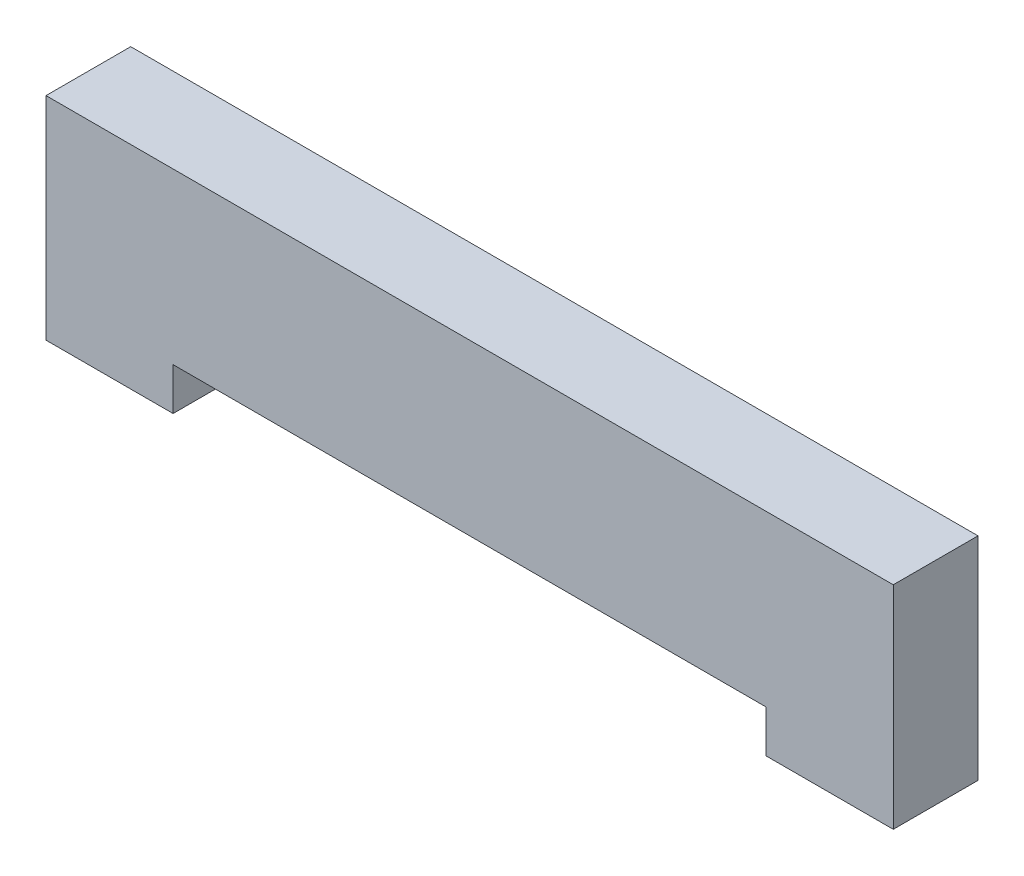
ISO-10303-21;
HEADER;
FILE_DESCRIPTION(('STEP AP214'),'2;1');
FILE_NAME('part.step','',(''),(''),'','','');
FILE_SCHEMA(('AUTOMOTIVE_DESIGN { 1 0 10303 214 1 1 1 1 }'));
ENDSEC;
DATA;
#1=APPLICATION_CONTEXT('core data for automotive mechanical design processes');
#2=APPLICATION_PROTOCOL_DEFINITION('international standard','automotive_design',2000,#1);
#3=PRODUCT_CONTEXT('',#1,'mechanical');
#4=PRODUCT('Part','Part','',(#3));
#5=PRODUCT_RELATED_PRODUCT_CATEGORY('part','',(#4));
#6=PRODUCT_DEFINITION_FORMATION('','',#4);
#7=PRODUCT_DEFINITION_CONTEXT('part definition',#1,'design');
#8=PRODUCT_DEFINITION('design','',#6,#7);
#9=PRODUCT_DEFINITION_SHAPE('','',#8);
#10=(LENGTH_UNIT() NAMED_UNIT(*) SI_UNIT(.MILLI.,.METRE.));
#11=(NAMED_UNIT(*) PLANE_ANGLE_UNIT() SI_UNIT($,.RADIAN.));
#12=(NAMED_UNIT(*) SI_UNIT($,.STERADIAN.) SOLID_ANGLE_UNIT());
#13=UNCERTAINTY_MEASURE_WITH_UNIT(LENGTH_MEASURE(1.E-05),#10,'distance_accuracy_value','');
#14=(GEOMETRIC_REPRESENTATION_CONTEXT(3) GLOBAL_UNCERTAINTY_ASSIGNED_CONTEXT((#13)) GLOBAL_UNIT_ASSIGNED_CONTEXT((#10,
#11,#12)) REPRESENTATION_CONTEXT('',''));
#15=CARTESIAN_POINT('',(0.,0.,0.));
#16=DIRECTION('',(0.,0.,1.));
#17=DIRECTION('',(1.,0.,0.));
#18=AXIS2_PLACEMENT_3D('',#15,#16,#17);
#19=CARTESIAN_POINT('',(0.,0.,0.));
#20=DIRECTION('',(0.,-1.,0.));
#21=DIRECTION('',(0.,0.,-1.));
#22=AXIS2_PLACEMENT_3D('',#19,#20,#21);
#23=PLANE('',#22);
#24=CARTESIAN_POINT('',(-42.5,0.,0.));
#25=DIRECTION('',(0.,-1.,0.));
#26=DIRECTION('',(0.,0.,-1.));
#27=AXIS2_PLACEMENT_3D('',#24,#25,#26);
#28=CIRCLE('',#27,2.);
#29=CARTESIAN_POINT('',(-42.5,0.,-2.));
#30=VERTEX_POINT('',#29);
#31=EDGE_CURVE('E180',#30,#30,#28,.T.);
#32=ORIENTED_EDGE('',*,*,#31,.F.);
#33=EDGE_LOOP('',(#32));
#34=FACE_BOUND('',#33,.T.);
#35=DIRECTION('',(0.,0.,1.));
#36=VECTOR('',#35,1.);
#37=CARTESIAN_POINT('',(-35.,0.,-5.001));
#38=LINE('',#37,#36);
#39=CARTESIAN_POINT('',(-35.,0.,-5.));
#40=VERTEX_POINT('',#39);
#41=CARTESIAN_POINT('',(-35.,0.,5.00000000000001));
#42=VERTEX_POINT('',#41);
#43=EDGE_CURVE('E109',#40,#42,#38,.T.);
#44=ORIENTED_EDGE('',*,*,#43,.T.);
#45=DIRECTION('',(1.,0.,0.));
#46=VECTOR('',#45,1.);
#47=CARTESIAN_POINT('',(50.,0.,5.));
#48=LINE('',#47,#46);
#49=CARTESIAN_POINT('',(-50.,0.,5.00000000000001));
#50=VERTEX_POINT('',#49);
#51=EDGE_CURVE('E141',#50,#42,#48,.T.);
#52=ORIENTED_EDGE('',*,*,#51,.F.);
#53=DIRECTION('',(0.,0.,1.));
#54=VECTOR('',#53,1.);
#55=CARTESIAN_POINT('',(-50.,0.,5.00000000000001));
#56=LINE('',#55,#54);
#57=CARTESIAN_POINT('',(-50.,0.,-5.));
#58=VERTEX_POINT('',#57);
#59=EDGE_CURVE('E133',#58,#50,#56,.T.);
#60=ORIENTED_EDGE('',*,*,#59,.F.);
#61=DIRECTION('',(-1.,0.,0.));
#62=VECTOR('',#61,1.);
#63=CARTESIAN_POINT('',(-50.,0.,-5.));
#64=LINE('',#63,#62);
#65=EDGE_CURVE('E126',#40,#58,#64,.T.);
#66=ORIENTED_EDGE('',*,*,#65,.F.);
#67=EDGE_LOOP('',(#44,#52,#60,#66));
#68=FACE_BOUND('',#67,.T.);
#69=ADVANCED_FACE('F36',(#34,#68),#23,.T.);
#70=CARTESIAN_POINT('',(50.,25.,0.));
#71=DIRECTION('',(-1.,0.,0.));
#72=DIRECTION('',(0.,0.,1.));
#73=AXIS2_PLACEMENT_3D('',#70,#71,#72);
#74=PLANE('',#73);
#75=DIRECTION('',(0.,0.,-1.));
#76=VECTOR('',#75,1.);
#77=CARTESIAN_POINT('',(50.,0.,0.));
#78=LINE('',#77,#76);
#79=CARTESIAN_POINT('',(50.,0.,5.));
#80=VERTEX_POINT('',#79);
#81=CARTESIAN_POINT('',(50.,0.,-5.));
#82=VERTEX_POINT('',#81);
#83=EDGE_CURVE('E120',#80,#82,#78,.T.);
#84=ORIENTED_EDGE('',*,*,#83,.T.);
#85=DIRECTION('',(0.,-1.,0.));
#86=VECTOR('',#85,1.);
#87=CARTESIAN_POINT('',(50.,25.,-5.));
#88=LINE('',#87,#86);
#89=CARTESIAN_POINT('',(50.,25.,-5.));
#90=VERTEX_POINT('',#89);
#91=EDGE_CURVE('E11',#90,#82,#88,.T.);
#92=ORIENTED_EDGE('',*,*,#91,.F.);
#93=DIRECTION('',(0.,0.,-1.));
#94=VECTOR('',#93,1.);
#95=CARTESIAN_POINT('',(50.,25.,0.));
#96=LINE('',#95,#94);
#97=CARTESIAN_POINT('',(50.,25.,5.));
#98=VERTEX_POINT('',#97);
#99=EDGE_CURVE('E86',#98,#90,#96,.T.);
#100=ORIENTED_EDGE('',*,*,#99,.F.);
#101=DIRECTION('',(0.,-1.,0.));
#102=VECTOR('',#101,1.);
#103=CARTESIAN_POINT('',(50.,25.,5.));
#104=LINE('',#103,#102);
#105=EDGE_CURVE('E143',#98,#80,#104,.T.);
#106=ORIENTED_EDGE('',*,*,#105,.T.);
#107=EDGE_LOOP('',(#84,#92,#100,#106));
#108=FACE_BOUND('',#107,.T.);
#109=ADVANCED_FACE('F38',(#108),#74,.F.);
#110=CARTESIAN_POINT('',(-50.,25.,-5.));
#111=DIRECTION('',(0.,0.,1.));
#112=DIRECTION('',(1.,0.,0.));
#113=AXIS2_PLACEMENT_3D('',#110,#111,#112);
#114=PLANE('',#113);
#115=DIRECTION('',(1.,0.,0.));
#116=VECTOR('',#115,1.);
#117=CARTESIAN_POINT('',(35.,5.,-5.));
#118=LINE('',#117,#116);
#119=CARTESIAN_POINT('',(-35.,4.99999999999999,-5.));
#120=VERTEX_POINT('',#119);
#121=CARTESIAN_POINT('',(35.,5.,-5.));
#122=VERTEX_POINT('',#121);
#123=EDGE_CURVE('E129',#120,#122,#118,.T.);
#124=ORIENTED_EDGE('',*,*,#123,.F.);
#125=DIRECTION('',(0.,1.,0.));
#126=VECTOR('',#125,1.);
#127=CARTESIAN_POINT('',(-35.,4.99999999999999,-5.));
#128=LINE('',#127,#126);
#129=EDGE_CURVE('E112',#40,#120,#128,.T.);
#130=ORIENTED_EDGE('',*,*,#129,.F.);
#131=ORIENTED_EDGE('',*,*,#65,.T.);
#132=DIRECTION('',(0.,-1.,0.));
#133=VECTOR('',#132,1.);
#134=CARTESIAN_POINT('',(-50.,25.,-5.));
#135=LINE('',#134,#133);
#136=CARTESIAN_POINT('',(-50.,25.,-5.));
#137=VERTEX_POINT('',#136);
#138=EDGE_CURVE('E44',#137,#58,#135,.T.);
#139=ORIENTED_EDGE('',*,*,#138,.F.);
#140=DIRECTION('',(-1.,0.,0.));
#141=VECTOR('',#140,1.);
#142=CARTESIAN_POINT('',(-50.,25.,-5.));
#143=LINE('',#142,#141);
#144=EDGE_CURVE('E154',#90,#137,#143,.T.);
#145=ORIENTED_EDGE('',*,*,#144,.F.);
#146=ORIENTED_EDGE('',*,*,#91,.T.);
#147=CARTESIAN_POINT('',(35.,0.,-5.));
#148=VERTEX_POINT('',#147);
#149=EDGE_CURVE('E134',#82,#148,#64,.T.);
#150=ORIENTED_EDGE('',*,*,#149,.T.);
#151=DIRECTION('',(0.,-1.,0.));
#152=VECTOR('',#151,1.);
#153=CARTESIAN_POINT('',(35.,0.,-5.));
#154=LINE('',#153,#152);
#155=EDGE_CURVE('E51',#122,#148,#154,.T.);
#156=ORIENTED_EDGE('',*,*,#155,.F.);
#157=EDGE_LOOP('',(#124,#130,#131,#139,#145,#146,#150,#156));
#158=FACE_BOUND('',#157,.T.);
#159=ADVANCED_FACE('F124',(#158),#114,.F.);
#160=CARTESIAN_POINT('',(-50.,25.,5.00000000000001));
#161=DIRECTION('',(1.,0.,0.));
#162=DIRECTION('',(0.,0.,-1.));
#163=AXIS2_PLACEMENT_3D('',#160,#161,#162);
#164=PLANE('',#163);
#165=ORIENTED_EDGE('',*,*,#59,.T.);
#166=DIRECTION('',(0.,-1.,0.));
#167=VECTOR('',#166,1.);
#168=CARTESIAN_POINT('',(-50.,25.,5.00000000000001));
#169=LINE('',#168,#167);
#170=CARTESIAN_POINT('',(-50.,25.,5.00000000000001));
#171=VERTEX_POINT('',#170);
#172=EDGE_CURVE('E146',#171,#50,#169,.T.);
#173=ORIENTED_EDGE('',*,*,#172,.F.);
#174=DIRECTION('',(0.,0.,1.));
#175=VECTOR('',#174,1.);
#176=CARTESIAN_POINT('',(-50.,25.,5.00000000000001));
#177=LINE('',#176,#175);
#178=EDGE_CURVE('E152',#137,#171,#177,.T.);
#179=ORIENTED_EDGE('',*,*,#178,.F.);
#180=ORIENTED_EDGE('',*,*,#138,.T.);
#181=EDGE_LOOP('',(#165,#173,#179,#180));
#182=FACE_BOUND('',#181,.T.);
#183=ADVANCED_FACE('F150',(#182),#164,.F.);
#184=CARTESIAN_POINT('',(50.,25.,5.));
#185=DIRECTION('',(0.,0.,-1.));
#186=DIRECTION('',(-1.,0.,0.));
#187=AXIS2_PLACEMENT_3D('',#184,#185,#186);
#188=PLANE('',#187);
#189=ORIENTED_EDGE('',*,*,#51,.T.);
#190=DIRECTION('',(0.,-1.,0.));
#191=VECTOR('',#190,1.);
#192=CARTESIAN_POINT('',(-35.,4.99999999999999,5.00000000000001));
#193=LINE('',#192,#191);
#194=CARTESIAN_POINT('',(-35.,4.99999999999999,5.00000000000001));
#195=VERTEX_POINT('',#194);
#196=EDGE_CURVE('E115',#195,#42,#193,.T.);
#197=ORIENTED_EDGE('',*,*,#196,.F.);
#198=DIRECTION('',(-1.,0.,0.));
#199=VECTOR('',#198,1.);
#200=CARTESIAN_POINT('',(35.,5.,5.00000000000001));
#201=LINE('',#200,#199);
#202=CARTESIAN_POINT('',(35.,5.,5.00000000000001));
#203=VERTEX_POINT('',#202);
#204=EDGE_CURVE('E166',#203,#195,#201,.T.);
#205=ORIENTED_EDGE('',*,*,#204,.F.);
#206=DIRECTION('',(0.,1.,0.));
#207=VECTOR('',#206,1.);
#208=CARTESIAN_POINT('',(35.,0.,5.00000000000001));
#209=LINE('',#208,#207);
#210=CARTESIAN_POINT('',(35.,0.,5.00000000000001));
#211=VERTEX_POINT('',#210);
#212=EDGE_CURVE('E130',#211,#203,#209,.T.);
#213=ORIENTED_EDGE('',*,*,#212,.F.);
#214=EDGE_CURVE('E81',#211,#80,#48,.T.);
#215=ORIENTED_EDGE('',*,*,#214,.T.);
#216=ORIENTED_EDGE('',*,*,#105,.F.);
#217=DIRECTION('',(1.,0.,0.));
#218=VECTOR('',#217,1.);
#219=CARTESIAN_POINT('',(50.,25.,5.));
#220=LINE('',#219,#218);
#221=EDGE_CURVE('E60',#171,#98,#220,.T.);
#222=ORIENTED_EDGE('',*,*,#221,.F.);
#223=ORIENTED_EDGE('',*,*,#172,.T.);
#224=EDGE_LOOP('',(#189,#197,#205,#213,#215,#216,#222,#223));
#225=FACE_BOUND('',#224,.T.);
#226=ADVANCED_FACE('F215',(#225),#188,.F.);
#227=CARTESIAN_POINT('',(0.,25.,0.));
#228=DIRECTION('',(0.,-1.,0.));
#229=DIRECTION('',(0.,0.,-1.));
#230=AXIS2_PLACEMENT_3D('',#227,#228,#229);
#231=PLANE('',#230);
#232=ORIENTED_EDGE('',*,*,#99,.T.);
#233=ORIENTED_EDGE('',*,*,#144,.T.);
#234=ORIENTED_EDGE('',*,*,#178,.T.);
#235=ORIENTED_EDGE('',*,*,#221,.T.);
#236=EDGE_LOOP('',(#232,#233,#234,#235));
#237=FACE_BOUND('',#236,.T.);
#238=ADVANCED_FACE('F206',(#237),#231,.F.);
#239=CARTESIAN_POINT('',(42.5,0.,0.));
#240=DIRECTION('',(0.,-1.,0.));
#241=DIRECTION('',(0.,0.,-1.));
#242=AXIS2_PLACEMENT_3D('',#239,#240,#241);
#243=CIRCLE('',#242,2.);
#244=CARTESIAN_POINT('',(42.5,0.,-2.));
#245=VERTEX_POINT('',#244);
#246=EDGE_CURVE('E174',#245,#245,#243,.T.);
#247=ORIENTED_EDGE('',*,*,#246,.F.);
#248=EDGE_LOOP('',(#247));
#249=FACE_BOUND('',#248,.T.);
#250=DIRECTION('',(0.,0.,1.));
#251=VECTOR('',#250,1.);
#252=CARTESIAN_POINT('',(35.,0.,-5.001));
#253=LINE('',#252,#251);
#254=EDGE_CURVE('E160',#148,#211,#253,.T.);
#255=ORIENTED_EDGE('',*,*,#254,.F.);
#256=ORIENTED_EDGE('',*,*,#149,.F.);
#257=ORIENTED_EDGE('',*,*,#83,.F.);
#258=ORIENTED_EDGE('',*,*,#214,.F.);
#259=EDGE_LOOP('',(#255,#256,#257,#258));
#260=FACE_BOUND('',#259,.T.);
#261=ADVANCED_FACE('F197',(#249,#260),#23,.T.);
#262=CARTESIAN_POINT('',(-35.,4.99999999999999,-5.001));
#263=DIRECTION('',(-1.,0.,0.));
#264=DIRECTION('',(0.,0.,1.));
#265=AXIS2_PLACEMENT_3D('',#262,#263,#264);
#266=PLANE('',#265);
#267=ORIENTED_EDGE('',*,*,#129,.T.);
#268=DIRECTION('',(0.,0.,1.));
#269=VECTOR('',#268,1.);
#270=CARTESIAN_POINT('',(-35.,4.99999999999999,-5.001));
#271=LINE('',#270,#269);
#272=EDGE_CURVE('E121',#120,#195,#271,.T.);
#273=ORIENTED_EDGE('',*,*,#272,.T.);
#274=ORIENTED_EDGE('',*,*,#196,.T.);
#275=ORIENTED_EDGE('',*,*,#43,.F.);
#276=EDGE_LOOP('',(#267,#273,#274,#275));
#277=FACE_BOUND('',#276,.T.);
#278=ADVANCED_FACE('F111',(#277),#266,.F.);
#279=CARTESIAN_POINT('',(35.,5.,-5.001));
#280=DIRECTION('',(0.,1.,0.));
#281=DIRECTION('',(-1.,0.,0.));
#282=AXIS2_PLACEMENT_3D('',#279,#280,#281);
#283=PLANE('',#282);
#284=ORIENTED_EDGE('',*,*,#123,.T.);
#285=DIRECTION('',(0.,0.,1.));
#286=VECTOR('',#285,1.);
#287=CARTESIAN_POINT('',(35.,5.,-5.001));
#288=LINE('',#287,#286);
#289=EDGE_CURVE('E162',#122,#203,#288,.T.);
#290=ORIENTED_EDGE('',*,*,#289,.T.);
#291=ORIENTED_EDGE('',*,*,#204,.T.);
#292=ORIENTED_EDGE('',*,*,#272,.F.);
#293=EDGE_LOOP('',(#284,#290,#291,#292));
#294=FACE_BOUND('',#293,.T.);
#295=ADVANCED_FACE('F212',(#294),#283,.F.);
#296=CARTESIAN_POINT('',(35.,0.,-5.001));
#297=DIRECTION('',(1.,0.,0.));
#298=DIRECTION('',(0.,0.,-1.));
#299=AXIS2_PLACEMENT_3D('',#296,#297,#298);
#300=PLANE('',#299);
#301=ORIENTED_EDGE('',*,*,#155,.T.);
#302=ORIENTED_EDGE('',*,*,#254,.T.);
#303=ORIENTED_EDGE('',*,*,#212,.T.);
#304=ORIENTED_EDGE('',*,*,#289,.F.);
#305=EDGE_LOOP('',(#301,#302,#303,#304));
#306=FACE_BOUND('',#305,.T.);
#307=ADVANCED_FACE('F218',(#306),#300,.F.);
#308=CARTESIAN_POINT('',(42.5,15.,0.));
#309=DIRECTION('',(0.,-1.,0.));
#310=DIRECTION('',(0.,0.,-1.));
#311=AXIS2_PLACEMENT_3D('',#308,#309,#310);
#312=CYLINDRICAL_SURFACE('',#311,2.);
#313=CARTESIAN_POINT('',(42.5,15.,0.));
#314=DIRECTION('',(0.,-1.,0.));
#315=DIRECTION('',(0.,0.,-1.));
#316=AXIS2_PLACEMENT_3D('',#313,#314,#315);
#317=CIRCLE('',#316,2.);
#318=CARTESIAN_POINT('',(42.5,15.,-2.));
#319=VERTEX_POINT('',#318);
#320=EDGE_CURVE('E177',#319,#319,#317,.T.);
#321=ORIENTED_EDGE('',*,*,#320,.F.);
#322=EDGE_LOOP('',(#321));
#323=FACE_BOUND('',#322,.T.);
#324=ORIENTED_EDGE('',*,*,#246,.T.);
#325=EDGE_LOOP('',(#324));
#326=FACE_BOUND('',#325,.T.);
#327=ADVANCED_FACE('F226',(#323,#326),#312,.F.);
#328=CARTESIAN_POINT('',(42.5,15.,0.));
#329=DIRECTION('',(0.,-1.,0.));
#330=DIRECTION('',(0.,0.,-1.));
#331=AXIS2_PLACEMENT_3D('',#328,#329,#330);
#332=PLANE('',#331);
#333=ORIENTED_EDGE('',*,*,#320,.T.);
#334=EDGE_LOOP('',(#333));
#335=FACE_BOUND('',#334,.T.);
#336=ADVANCED_FACE('F191',(#335),#332,.T.);
#337=CARTESIAN_POINT('',(-42.5,15.,0.));
#338=DIRECTION('',(0.,-1.,0.));
#339=DIRECTION('',(0.,0.,-1.));
#340=AXIS2_PLACEMENT_3D('',#337,#338,#339);
#341=CYLINDRICAL_SURFACE('',#340,2.);
#342=CARTESIAN_POINT('',(-42.5,15.,0.));
#343=DIRECTION('',(0.,-1.,0.));
#344=DIRECTION('',(0.,0.,-1.));
#345=AXIS2_PLACEMENT_3D('',#342,#343,#344);
#346=CIRCLE('',#345,2.);
#347=CARTESIAN_POINT('',(-42.5,15.,-2.));
#348=VERTEX_POINT('',#347);
#349=EDGE_CURVE('E173',#348,#348,#346,.T.);
#350=ORIENTED_EDGE('',*,*,#349,.F.);
#351=EDGE_LOOP('',(#350));
#352=FACE_BOUND('',#351,.T.);
#353=ORIENTED_EDGE('',*,*,#31,.T.);
#354=EDGE_LOOP('',(#353));
#355=FACE_BOUND('',#354,.T.);
#356=ADVANCED_FACE('F188',(#352,#355),#341,.F.);
#357=CARTESIAN_POINT('',(-42.5,15.,0.));
#358=DIRECTION('',(0.,-1.,0.));
#359=DIRECTION('',(0.,0.,-1.));
#360=AXIS2_PLACEMENT_3D('',#357,#358,#359);
#361=PLANE('',#360);
#362=ORIENTED_EDGE('',*,*,#349,.T.);
#363=EDGE_LOOP('',(#362));
#364=FACE_BOUND('',#363,.T.);
#365=ADVANCED_FACE('F186',(#364),#361,.T.);
#366=CLOSED_SHELL('',(#69,#109,#159,#183,#226,#238,#261,#278,#295,#307,#327,#336,#356,#365));
#367=MANIFOLD_SOLID_BREP('B2',#366);
#368=ADVANCED_BREP_SHAPE_REPRESENTATION('',(#18,#367),#14);
#369=SHAPE_DEFINITION_REPRESENTATION(#9,#368);
ENDSEC;
END-ISO-10303-21;
